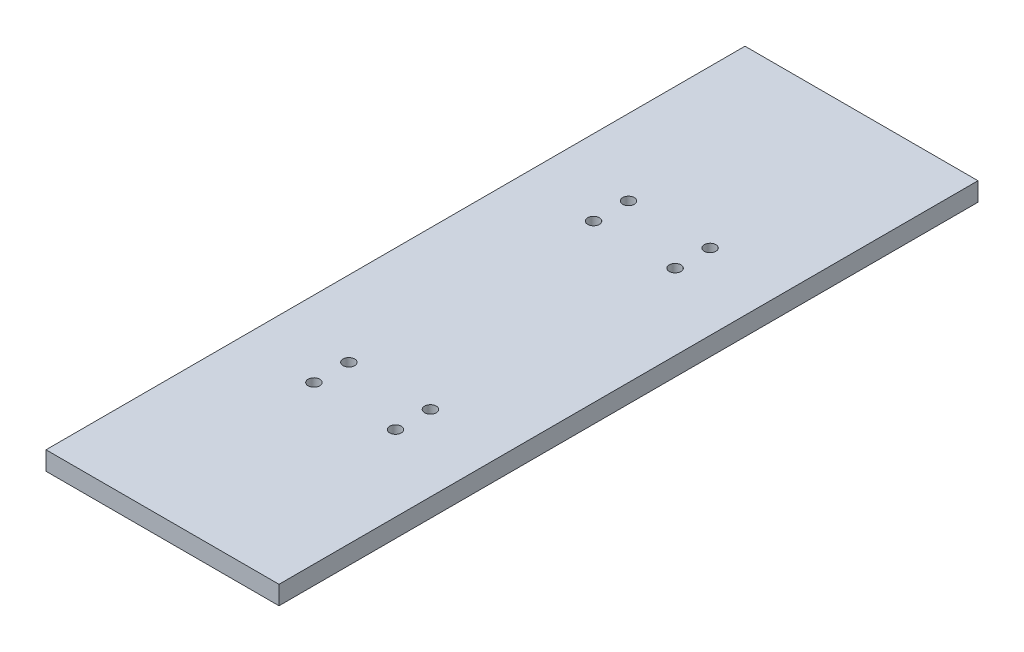
ISO-10303-21;
HEADER;
FILE_DESCRIPTION(('STEP AP214'),'2;1');
FILE_NAME('part.step','',(''),(''),'','','');
FILE_SCHEMA(('AUTOMOTIVE_DESIGN { 1 0 10303 214 1 1 1 1 }'));
ENDSEC;
DATA;
#1=APPLICATION_CONTEXT('core data for automotive mechanical design processes');
#2=APPLICATION_PROTOCOL_DEFINITION('international standard','automotive_design',2000,#1);
#3=PRODUCT_CONTEXT('',#1,'mechanical');
#4=PRODUCT('Part','Part','',(#3));
#5=PRODUCT_RELATED_PRODUCT_CATEGORY('part','',(#4));
#6=PRODUCT_DEFINITION_FORMATION('','',#4);
#7=PRODUCT_DEFINITION_CONTEXT('part definition',#1,'design');
#8=PRODUCT_DEFINITION('design','',#6,#7);
#9=PRODUCT_DEFINITION_SHAPE('','',#8);
#10=(LENGTH_UNIT() NAMED_UNIT(*) SI_UNIT(.MILLI.,.METRE.));
#11=(NAMED_UNIT(*) PLANE_ANGLE_UNIT() SI_UNIT($,.RADIAN.));
#12=(NAMED_UNIT(*) SI_UNIT($,.STERADIAN.) SOLID_ANGLE_UNIT());
#13=UNCERTAINTY_MEASURE_WITH_UNIT(LENGTH_MEASURE(1.E-05),#10,'distance_accuracy_value','');
#14=(GEOMETRIC_REPRESENTATION_CONTEXT(3) GLOBAL_UNCERTAINTY_ASSIGNED_CONTEXT((#13)) GLOBAL_UNIT_ASSIGNED_CONTEXT((#10,
#11,#12)) REPRESENTATION_CONTEXT('',''));
#15=CARTESIAN_POINT('',(0.,0.,0.));
#16=DIRECTION('',(0.,0.,1.));
#17=DIRECTION('',(1.,0.,0.));
#18=AXIS2_PLACEMENT_3D('',#15,#16,#17);
#19=CARTESIAN_POINT('',(-50.,8.,150.));
#20=DIRECTION('',(1.,0.,0.));
#21=DIRECTION('',(0.,0.,-1.));
#22=AXIS2_PLACEMENT_3D('',#19,#20,#21);
#23=PLANE('',#22);
#24=DIRECTION('',(0.,0.,1.));
#25=VECTOR('',#24,1.);
#26=CARTESIAN_POINT('',(-50.,0.,150.));
#27=LINE('',#26,#25);
#28=CARTESIAN_POINT('',(-50.,0.,-150.));
#29=VERTEX_POINT('',#28);
#30=CARTESIAN_POINT('',(-50.,0.,150.));
#31=VERTEX_POINT('',#30);
#32=EDGE_CURVE('E98',#29,#31,#27,.T.);
#33=ORIENTED_EDGE('',*,*,#32,.T.);
#34=DIRECTION('',(0.,-1.,0.));
#35=VECTOR('',#34,1.);
#36=CARTESIAN_POINT('',(-50.,8.,150.));
#37=LINE('',#36,#35);
#38=CARTESIAN_POINT('',(-50.,8.,150.));
#39=VERTEX_POINT('',#38);
#40=EDGE_CURVE('E11',#39,#31,#37,.T.);
#41=ORIENTED_EDGE('',*,*,#40,.F.);
#42=DIRECTION('',(0.,0.,1.));
#43=VECTOR('',#42,1.);
#44=CARTESIAN_POINT('',(-50.,8.,150.));
#45=LINE('',#44,#43);
#46=CARTESIAN_POINT('',(-50.,8.,-150.));
#47=VERTEX_POINT('',#46);
#48=EDGE_CURVE('E86',#47,#39,#45,.T.);
#49=ORIENTED_EDGE('',*,*,#48,.F.);
#50=DIRECTION('',(0.,-1.,0.));
#51=VECTOR('',#50,1.);
#52=CARTESIAN_POINT('',(-50.,8.,-150.));
#53=LINE('',#52,#51);
#54=EDGE_CURVE('E94',#47,#29,#53,.T.);
#55=ORIENTED_EDGE('',*,*,#54,.T.);
#56=EDGE_LOOP('',(#33,#41,#49,#55));
#57=FACE_BOUND('',#56,.T.);
#58=ADVANCED_FACE('F35',(#57),#23,.F.);
#59=CARTESIAN_POINT('',(50.,8.,150.));
#60=DIRECTION('',(0.,0.,-1.));
#61=DIRECTION('',(-1.,0.,0.));
#62=AXIS2_PLACEMENT_3D('',#59,#60,#61);
#63=PLANE('',#62);
#64=DIRECTION('',(1.,0.,0.));
#65=VECTOR('',#64,1.);
#66=CARTESIAN_POINT('',(50.,0.,150.));
#67=LINE('',#66,#65);
#68=CARTESIAN_POINT('',(50.,0.,150.));
#69=VERTEX_POINT('',#68);
#70=EDGE_CURVE('E90',#31,#69,#67,.T.);
#71=ORIENTED_EDGE('',*,*,#70,.T.);
#72=DIRECTION('',(0.,-1.,0.));
#73=VECTOR('',#72,1.);
#74=CARTESIAN_POINT('',(50.,8.,150.));
#75=LINE('',#74,#73);
#76=CARTESIAN_POINT('',(50.,8.,150.));
#77=VERTEX_POINT('',#76);
#78=EDGE_CURVE('E43',#77,#69,#75,.T.);
#79=ORIENTED_EDGE('',*,*,#78,.F.);
#80=DIRECTION('',(1.,0.,0.));
#81=VECTOR('',#80,1.);
#82=CARTESIAN_POINT('',(50.,8.,150.));
#83=LINE('',#82,#81);
#84=EDGE_CURVE('E81',#39,#77,#83,.T.);
#85=ORIENTED_EDGE('',*,*,#84,.F.);
#86=ORIENTED_EDGE('',*,*,#40,.T.);
#87=EDGE_LOOP('',(#71,#79,#85,#86));
#88=FACE_BOUND('',#87,.T.);
#89=ADVANCED_FACE('F89',(#88),#63,.F.);
#90=CARTESIAN_POINT('',(50.,8.,150.));
#91=DIRECTION('',(-1.,0.,0.));
#92=DIRECTION('',(0.,0.,1.));
#93=AXIS2_PLACEMENT_3D('',#90,#91,#92);
#94=PLANE('',#93);
#95=DIRECTION('',(0.,0.,-1.));
#96=VECTOR('',#95,1.);
#97=CARTESIAN_POINT('',(50.,0.,150.));
#98=LINE('',#97,#96);
#99=CARTESIAN_POINT('',(50.,0.,-150.));
#100=VERTEX_POINT('',#99);
#101=EDGE_CURVE('E68',#69,#100,#98,.T.);
#102=ORIENTED_EDGE('',*,*,#101,.T.);
#103=DIRECTION('',(0.,-1.,0.));
#104=VECTOR('',#103,1.);
#105=CARTESIAN_POINT('',(50.,8.,-150.));
#106=LINE('',#105,#104);
#107=CARTESIAN_POINT('',(50.,8.,-150.));
#108=VERTEX_POINT('',#107);
#109=EDGE_CURVE('E91',#108,#100,#106,.T.);
#110=ORIENTED_EDGE('',*,*,#109,.F.);
#111=DIRECTION('',(0.,0.,-1.));
#112=VECTOR('',#111,1.);
#113=CARTESIAN_POINT('',(50.,8.,150.));
#114=LINE('',#113,#112);
#115=EDGE_CURVE('E84',#77,#108,#114,.T.);
#116=ORIENTED_EDGE('',*,*,#115,.F.);
#117=ORIENTED_EDGE('',*,*,#78,.T.);
#118=EDGE_LOOP('',(#102,#110,#116,#117));
#119=FACE_BOUND('',#118,.T.);
#120=ADVANCED_FACE('F92',(#119),#94,.F.);
#121=CARTESIAN_POINT('',(50.,8.,-150.));
#122=DIRECTION('',(0.,0.,1.));
#123=DIRECTION('',(1.,0.,0.));
#124=AXIS2_PLACEMENT_3D('',#121,#122,#123);
#125=PLANE('',#124);
#126=DIRECTION('',(-1.,0.,0.));
#127=VECTOR('',#126,1.);
#128=CARTESIAN_POINT('',(50.,0.,-150.));
#129=LINE('',#128,#127);
#130=EDGE_CURVE('E74',#100,#29,#129,.T.);
#131=ORIENTED_EDGE('',*,*,#130,.T.);
#132=ORIENTED_EDGE('',*,*,#54,.F.);
#133=DIRECTION('',(-1.,0.,0.));
#134=VECTOR('',#133,1.);
#135=CARTESIAN_POINT('',(50.,8.,-150.));
#136=LINE('',#135,#134);
#137=EDGE_CURVE('E51',#108,#47,#136,.T.);
#138=ORIENTED_EDGE('',*,*,#137,.F.);
#139=ORIENTED_EDGE('',*,*,#109,.T.);
#140=EDGE_LOOP('',(#131,#132,#138,#139));
#141=FACE_BOUND('',#140,.T.);
#142=ADVANCED_FACE('F106',(#141),#125,.F.);
#143=CARTESIAN_POINT('',(0.,8.,0.));
#144=DIRECTION('',(0.,1.,0.));
#145=DIRECTION('',(0.,0.,1.));
#146=AXIS2_PLACEMENT_3D('',#143,#144,#145);
#147=PLANE('',#146);
#148=CARTESIAN_POINT('',(-17.5000000000036,8.00000000000499,-67.5000000000054));
#149=DIRECTION('',(0.,-1.,0.));
#150=DIRECTION('',(0.,0.,1.));
#151=AXIS2_PLACEMENT_3D('',#148,#149,#150);
#152=CIRCLE('',#151,2.50000000000002);
#153=CARTESIAN_POINT('',(-17.5000000000036,8.00000000000498,-65.0000000000054));
#154=VERTEX_POINT('',#153);
#155=EDGE_CURVE('E156',#154,#154,#152,.T.);
#156=ORIENTED_EDGE('',*,*,#155,.T.);
#157=EDGE_LOOP('',(#156));
#158=FACE_BOUND('',#157,.T.);
#159=CARTESIAN_POINT('',(-17.5000000000036,8.00000000000494,67.5000000000054));
#160=DIRECTION('',(0.,1.,0.));
#161=DIRECTION('',(0.,0.,-1.));
#162=AXIS2_PLACEMENT_3D('',#159,#160,#161);
#163=CIRCLE('',#162,2.50000000000002);
#164=CARTESIAN_POINT('',(-17.5000000000036,8.00000000000494,65.0000000000054));
#165=VERTEX_POINT('',#164);
#166=EDGE_CURVE('E150',#165,#165,#163,.T.);
#167=ORIENTED_EDGE('',*,*,#166,.F.);
#168=EDGE_LOOP('',(#167));
#169=FACE_BOUND('',#168,.T.);
#170=CARTESIAN_POINT('',(-17.5000000000036,8.00000000000498,-52.5000000000054));
#171=DIRECTION('',(0.,-1.,0.));
#172=DIRECTION('',(0.,0.,1.));
#173=AXIS2_PLACEMENT_3D('',#170,#171,#172);
#174=CIRCLE('',#173,2.50000000000002);
#175=CARTESIAN_POINT('',(-17.5000000000036,8.00000000000497,-50.0000000000054));
#176=VERTEX_POINT('',#175);
#177=EDGE_CURVE('E144',#176,#176,#174,.T.);
#178=ORIENTED_EDGE('',*,*,#177,.T.);
#179=EDGE_LOOP('',(#178));
#180=FACE_BOUND('',#179,.T.);
#181=CARTESIAN_POINT('',(-17.5000000000036,8.00000000000494,52.5000000000054));
#182=DIRECTION('',(0.,1.,0.));
#183=DIRECTION('',(0.,0.,-1.));
#184=AXIS2_PLACEMENT_3D('',#181,#182,#183);
#185=CIRCLE('',#184,2.50000000000002);
#186=CARTESIAN_POINT('',(-17.5000000000036,8.00000000000494,50.0000000000054));
#187=VERTEX_POINT('',#186);
#188=EDGE_CURVE('E138',#187,#187,#185,.T.);
#189=ORIENTED_EDGE('',*,*,#188,.F.);
#190=EDGE_LOOP('',(#189));
#191=FACE_BOUND('',#190,.T.);
#192=CARTESIAN_POINT('',(17.5000000000036,8.00000000000499,-67.5000000000054));
#193=DIRECTION('',(0.,1.,0.));
#194=DIRECTION('',(0.,0.,1.));
#195=AXIS2_PLACEMENT_3D('',#192,#193,#194);
#196=CIRCLE('',#195,2.50000000000002);
#197=CARTESIAN_POINT('',(17.5000000000036,8.00000000000498,-65.0000000000054));
#198=VERTEX_POINT('',#197);
#199=EDGE_CURVE('E132',#198,#198,#196,.T.);
#200=ORIENTED_EDGE('',*,*,#199,.F.);
#201=EDGE_LOOP('',(#200));
#202=FACE_BOUND('',#201,.T.);
#203=CARTESIAN_POINT('',(17.5000000000036,8.00000000000498,-52.5000000000054));
#204=DIRECTION('',(0.,1.,0.));
#205=DIRECTION('',(0.,0.,1.));
#206=AXIS2_PLACEMENT_3D('',#203,#204,#205);
#207=CIRCLE('',#206,2.50000000000002);
#208=CARTESIAN_POINT('',(17.5000000000036,8.00000000000497,-50.0000000000054));
#209=VERTEX_POINT('',#208);
#210=EDGE_CURVE('E126',#209,#209,#207,.T.);
#211=ORIENTED_EDGE('',*,*,#210,.F.);
#212=EDGE_LOOP('',(#211));
#213=FACE_BOUND('',#212,.T.);
#214=CARTESIAN_POINT('',(17.5000000000036,8.00000000000494,67.5000000000054));
#215=DIRECTION('',(0.,-1.,0.));
#216=DIRECTION('',(0.,0.,-1.));
#217=AXIS2_PLACEMENT_3D('',#214,#215,#216);
#218=CIRCLE('',#217,2.50000000000002);
#219=CARTESIAN_POINT('',(17.5000000000036,8.00000000000494,65.0000000000054));
#220=VERTEX_POINT('',#219);
#221=EDGE_CURVE('E115',#220,#220,#218,.T.);
#222=ORIENTED_EDGE('',*,*,#221,.T.);
#223=EDGE_LOOP('',(#222));
#224=FACE_BOUND('',#223,.T.);
#225=CARTESIAN_POINT('',(17.5000000000036,8.00000000000494,52.5000000000054));
#226=DIRECTION('',(0.,-1.,0.));
#227=DIRECTION('',(0.,0.,-1.));
#228=AXIS2_PLACEMENT_3D('',#225,#226,#227);
#229=CIRCLE('',#228,2.50000000000002);
#230=CARTESIAN_POINT('',(17.5000000000036,8.00000000000494,50.0000000000054));
#231=VERTEX_POINT('',#230);
#232=EDGE_CURVE('E101',#231,#231,#229,.T.);
#233=ORIENTED_EDGE('',*,*,#232,.T.);
#234=EDGE_LOOP('',(#233));
#235=FACE_BOUND('',#234,.T.);
#236=ORIENTED_EDGE('',*,*,#48,.T.);
#237=ORIENTED_EDGE('',*,*,#84,.T.);
#238=ORIENTED_EDGE('',*,*,#115,.T.);
#239=ORIENTED_EDGE('',*,*,#137,.T.);
#240=EDGE_LOOP('',(#236,#237,#238,#239));
#241=FACE_BOUND('',#240,.T.);
#242=ADVANCED_FACE('F82',(#158,#169,#180,#191,#202,#213,#224,#235,#241),#147,.T.);
#243=CARTESIAN_POINT('',(0.,0.,0.));
#244=DIRECTION('',(0.,1.,0.));
#245=DIRECTION('',(0.,0.,1.));
#246=AXIS2_PLACEMENT_3D('',#243,#244,#245);
#247=PLANE('',#246);
#248=CARTESIAN_POINT('',(-17.5000000000036,4.98545649207927E-12,-67.5000000000054));
#249=DIRECTION('',(0.,-1.,0.));
#250=DIRECTION('',(0.,0.,1.));
#251=AXIS2_PLACEMENT_3D('',#248,#249,#250);
#252=CIRCLE('',#251,2.50000000000002);
#253=CARTESIAN_POINT('',(-17.5000000000036,4.98379115754233E-12,-65.0000000000054));
#254=VERTEX_POINT('',#253);
#255=EDGE_CURVE('E153',#254,#254,#252,.T.);
#256=ORIENTED_EDGE('',*,*,#255,.F.);
#257=EDGE_LOOP('',(#256));
#258=FACE_BOUND('',#257,.T.);
#259=CARTESIAN_POINT('',(-17.5000000000036,4.94049245958195E-12,67.5000000000054));
#260=DIRECTION('',(0.,1.,0.));
#261=DIRECTION('',(0.,0.,-1.));
#262=AXIS2_PLACEMENT_3D('',#259,#260,#261);
#263=CIRCLE('',#262,2.50000000000002);
#264=CARTESIAN_POINT('',(-17.5000000000036,4.94049245958195E-12,65.0000000000054));
#265=VERTEX_POINT('',#264);
#266=EDGE_CURVE('E147',#265,#265,#263,.T.);
#267=ORIENTED_EDGE('',*,*,#266,.T.);
#268=EDGE_LOOP('',(#267));
#269=FACE_BOUND('',#268,.T.);
#270=CARTESIAN_POINT('',(-17.5000000000036,4.97546448485764E-12,-52.5000000000054));
#271=DIRECTION('',(0.,-1.,0.));
#272=DIRECTION('',(0.,0.,1.));
#273=AXIS2_PLACEMENT_3D('',#270,#271,#272);
#274=CIRCLE('',#273,2.50000000000002);
#275=CARTESIAN_POINT('',(-17.5000000000036,4.9737991503207E-12,-50.0000000000054));
#276=VERTEX_POINT('',#275);
#277=EDGE_CURVE('E141',#276,#276,#274,.T.);
#278=ORIENTED_EDGE('',*,*,#277,.F.);
#279=EDGE_LOOP('',(#278));
#280=FACE_BOUND('',#279,.T.);
#281=CARTESIAN_POINT('',(-17.5000000000036,4.94049245958195E-12,52.5000000000054));
#282=DIRECTION('',(0.,1.,0.));
#283=DIRECTION('',(0.,0.,-1.));
#284=AXIS2_PLACEMENT_3D('',#281,#282,#283);
#285=CIRCLE('',#284,2.50000000000002);
#286=CARTESIAN_POINT('',(-17.5000000000036,4.94049245958195E-12,50.0000000000054));
#287=VERTEX_POINT('',#286);
#288=EDGE_CURVE('E135',#287,#287,#285,.T.);
#289=ORIENTED_EDGE('',*,*,#288,.T.);
#290=EDGE_LOOP('',(#289));
#291=FACE_BOUND('',#290,.T.);
#292=CARTESIAN_POINT('',(17.5000000000036,4.98545649207927E-12,-67.5000000000054));
#293=DIRECTION('',(0.,1.,0.));
#294=DIRECTION('',(0.,0.,1.));
#295=AXIS2_PLACEMENT_3D('',#292,#293,#294);
#296=CIRCLE('',#295,2.50000000000002);
#297=CARTESIAN_POINT('',(17.5000000000036,4.98379115754233E-12,-65.0000000000054));
#298=VERTEX_POINT('',#297);
#299=EDGE_CURVE('E129',#298,#298,#296,.T.);
#300=ORIENTED_EDGE('',*,*,#299,.T.);
#301=EDGE_LOOP('',(#300));
#302=FACE_BOUND('',#301,.T.);
#303=CARTESIAN_POINT('',(17.5000000000036,4.97546448485764E-12,-52.5000000000054));
#304=DIRECTION('',(0.,1.,0.));
#305=DIRECTION('',(0.,0.,1.));
#306=AXIS2_PLACEMENT_3D('',#303,#304,#305);
#307=CIRCLE('',#306,2.50000000000002);
#308=CARTESIAN_POINT('',(17.5000000000036,4.9737991503207E-12,-50.0000000000054));
#309=VERTEX_POINT('',#308);
#310=EDGE_CURVE('E121',#309,#309,#307,.T.);
#311=ORIENTED_EDGE('',*,*,#310,.T.);
#312=EDGE_LOOP('',(#311));
#313=FACE_BOUND('',#312,.T.);
#314=CARTESIAN_POINT('',(17.5000000000036,4.94049245958195E-12,67.5000000000054));
#315=DIRECTION('',(0.,-1.,0.));
#316=DIRECTION('',(0.,0.,-1.));
#317=AXIS2_PLACEMENT_3D('',#314,#315,#316);
#318=CIRCLE('',#317,2.50000000000002);
#319=CARTESIAN_POINT('',(17.5000000000036,4.94049245958195E-12,65.0000000000054));
#320=VERTEX_POINT('',#319);
#321=EDGE_CURVE('E118',#320,#320,#318,.T.);
#322=ORIENTED_EDGE('',*,*,#321,.F.);
#323=EDGE_LOOP('',(#322));
#324=FACE_BOUND('',#323,.T.);
#325=CARTESIAN_POINT('',(17.5000000000036,4.94049245958195E-12,52.5000000000054));
#326=DIRECTION('',(0.,-1.,0.));
#327=DIRECTION('',(0.,0.,-1.));
#328=AXIS2_PLACEMENT_3D('',#325,#326,#327);
#329=CIRCLE('',#328,2.50000000000002);
#330=CARTESIAN_POINT('',(17.5000000000036,4.94049245958195E-12,50.0000000000054));
#331=VERTEX_POINT('',#330);
#332=EDGE_CURVE('E112',#331,#331,#329,.T.);
#333=ORIENTED_EDGE('',*,*,#332,.F.);
#334=EDGE_LOOP('',(#333));
#335=FACE_BOUND('',#334,.T.);
#336=ORIENTED_EDGE('',*,*,#32,.F.);
#337=ORIENTED_EDGE('',*,*,#130,.F.);
#338=ORIENTED_EDGE('',*,*,#101,.F.);
#339=ORIENTED_EDGE('',*,*,#70,.F.);
#340=EDGE_LOOP('',(#336,#337,#338,#339));
#341=FACE_BOUND('',#340,.T.);
#342=ADVANCED_FACE('F109',(#258,#269,#280,#291,#302,#313,#324,#335,#341),#247,.F.);
#343=CARTESIAN_POINT('',(17.5000000000036,8.00000000000494,52.5000000000054));
#344=DIRECTION('',(0.,-1.,0.));
#345=DIRECTION('',(0.,0.,-1.));
#346=AXIS2_PLACEMENT_3D('',#343,#344,#345);
#347=CYLINDRICAL_SURFACE('',#346,2.50000000000002);
#348=ORIENTED_EDGE('',*,*,#232,.F.);
#349=EDGE_LOOP('',(#348));
#350=FACE_BOUND('',#349,.T.);
#351=ORIENTED_EDGE('',*,*,#332,.T.);
#352=EDGE_LOOP('',(#351));
#353=FACE_BOUND('',#352,.T.);
#354=ADVANCED_FACE('F171',(#350,#353),#347,.F.);
#355=CARTESIAN_POINT('',(17.5000000000036,8.00000000000494,67.5000000000054));
#356=DIRECTION('',(0.,-1.,0.));
#357=DIRECTION('',(0.,0.,-1.));
#358=AXIS2_PLACEMENT_3D('',#355,#356,#357);
#359=CYLINDRICAL_SURFACE('',#358,2.50000000000002);
#360=ORIENTED_EDGE('',*,*,#221,.F.);
#361=EDGE_LOOP('',(#360));
#362=FACE_BOUND('',#361,.T.);
#363=ORIENTED_EDGE('',*,*,#321,.T.);
#364=EDGE_LOOP('',(#363));
#365=FACE_BOUND('',#364,.T.);
#366=ADVANCED_FACE('F188',(#362,#365),#359,.F.);
#367=CARTESIAN_POINT('',(17.5000000000036,8.00000000000498,-52.5000000000054));
#368=DIRECTION('',(0.,-1.,0.));
#369=DIRECTION('',(0.,0.,1.));
#370=AXIS2_PLACEMENT_3D('',#367,#368,#369);
#371=CYLINDRICAL_SURFACE('',#370,2.50000000000002);
#372=ORIENTED_EDGE('',*,*,#210,.T.);
#373=EDGE_LOOP('',(#372));
#374=FACE_BOUND('',#373,.T.);
#375=ORIENTED_EDGE('',*,*,#310,.F.);
#376=EDGE_LOOP('',(#375));
#377=FACE_BOUND('',#376,.T.);
#378=ADVANCED_FACE('F194',(#374,#377),#371,.F.);
#379=CARTESIAN_POINT('',(17.5000000000036,8.00000000000499,-67.5000000000054));
#380=DIRECTION('',(0.,-1.,0.));
#381=DIRECTION('',(0.,0.,1.));
#382=AXIS2_PLACEMENT_3D('',#379,#380,#381);
#383=CYLINDRICAL_SURFACE('',#382,2.50000000000002);
#384=ORIENTED_EDGE('',*,*,#199,.T.);
#385=EDGE_LOOP('',(#384));
#386=FACE_BOUND('',#385,.T.);
#387=ORIENTED_EDGE('',*,*,#299,.F.);
#388=EDGE_LOOP('',(#387));
#389=FACE_BOUND('',#388,.T.);
#390=ADVANCED_FACE('F231',(#386,#389),#383,.F.);
#391=CARTESIAN_POINT('',(-17.5000000000036,8.00000000000494,52.5000000000054));
#392=DIRECTION('',(0.,-1.,0.));
#393=DIRECTION('',(0.,0.,-1.));
#394=AXIS2_PLACEMENT_3D('',#391,#392,#393);
#395=CYLINDRICAL_SURFACE('',#394,2.50000000000002);
#396=ORIENTED_EDGE('',*,*,#188,.T.);
#397=EDGE_LOOP('',(#396));
#398=FACE_BOUND('',#397,.T.);
#399=ORIENTED_EDGE('',*,*,#288,.F.);
#400=EDGE_LOOP('',(#399));
#401=FACE_BOUND('',#400,.T.);
#402=ADVANCED_FACE('F225',(#398,#401),#395,.F.);
#403=CARTESIAN_POINT('',(-17.5000000000036,8.00000000000498,-52.5000000000054));
#404=DIRECTION('',(0.,-1.,0.));
#405=DIRECTION('',(0.,0.,1.));
#406=AXIS2_PLACEMENT_3D('',#403,#404,#405);
#407=CYLINDRICAL_SURFACE('',#406,2.50000000000002);
#408=ORIENTED_EDGE('',*,*,#177,.F.);
#409=EDGE_LOOP('',(#408));
#410=FACE_BOUND('',#409,.T.);
#411=ORIENTED_EDGE('',*,*,#277,.T.);
#412=EDGE_LOOP('',(#411));
#413=FACE_BOUND('',#412,.T.);
#414=ADVANCED_FACE('F230',(#410,#413),#407,.F.);
#415=CARTESIAN_POINT('',(-17.5000000000036,8.00000000000494,67.5000000000054));
#416=DIRECTION('',(0.,-1.,0.));
#417=DIRECTION('',(0.,0.,-1.));
#418=AXIS2_PLACEMENT_3D('',#415,#416,#417);
#419=CYLINDRICAL_SURFACE('',#418,2.50000000000002);
#420=ORIENTED_EDGE('',*,*,#166,.T.);
#421=EDGE_LOOP('',(#420));
#422=FACE_BOUND('',#421,.T.);
#423=ORIENTED_EDGE('',*,*,#266,.F.);
#424=EDGE_LOOP('',(#423));
#425=FACE_BOUND('',#424,.T.);
#426=ADVANCED_FACE('F165',(#422,#425),#419,.F.);
#427=CARTESIAN_POINT('',(-17.5000000000036,8.00000000000499,-67.5000000000054));
#428=DIRECTION('',(0.,-1.,0.));
#429=DIRECTION('',(0.,0.,1.));
#430=AXIS2_PLACEMENT_3D('',#427,#428,#429);
#431=CYLINDRICAL_SURFACE('',#430,2.50000000000002);
#432=ORIENTED_EDGE('',*,*,#155,.F.);
#433=EDGE_LOOP('',(#432));
#434=FACE_BOUND('',#433,.T.);
#435=ORIENTED_EDGE('',*,*,#255,.T.);
#436=EDGE_LOOP('',(#435));
#437=FACE_BOUND('',#436,.T.);
#438=ADVANCED_FACE('F162',(#434,#437),#431,.F.);
#439=CLOSED_SHELL('',(#58,#89,#120,#142,#242,#342,#354,#366,#378,#390,#402,#414,#426,#438));
#440=MANIFOLD_SOLID_BREP('B2',#439);
#441=ADVANCED_BREP_SHAPE_REPRESENTATION('',(#18,#440),#14);
#442=SHAPE_DEFINITION_REPRESENTATION(#9,#441);
ENDSEC;
END-ISO-10303-21;
